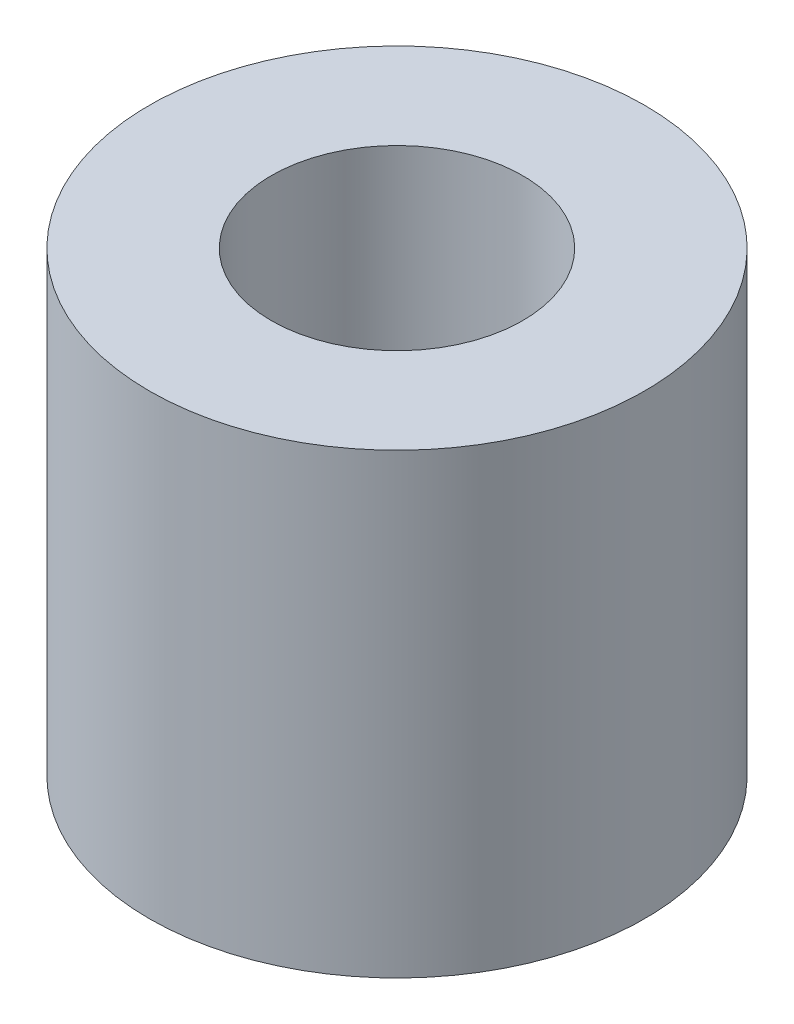
ISO-10303-21;
HEADER;
FILE_DESCRIPTION(('STEP AP214'),'2;1');
FILE_NAME('part.step','',(''),(''),'','','');
FILE_SCHEMA(('AUTOMOTIVE_DESIGN { 1 0 10303 214 1 1 1 1 }'));
ENDSEC;
DATA;
#1=APPLICATION_CONTEXT('core data for automotive mechanical design processes');
#2=APPLICATION_PROTOCOL_DEFINITION('international standard','automotive_design',2000,#1);
#3=PRODUCT_CONTEXT('',#1,'mechanical');
#4=PRODUCT('Part','Part','',(#3));
#5=PRODUCT_RELATED_PRODUCT_CATEGORY('part','',(#4));
#6=PRODUCT_DEFINITION_FORMATION('','',#4);
#7=PRODUCT_DEFINITION_CONTEXT('part definition',#1,'design');
#8=PRODUCT_DEFINITION('design','',#6,#7);
#9=PRODUCT_DEFINITION_SHAPE('','',#8);
#10=(LENGTH_UNIT() NAMED_UNIT(*) SI_UNIT(.MILLI.,.METRE.));
#11=(NAMED_UNIT(*) PLANE_ANGLE_UNIT() SI_UNIT($,.RADIAN.));
#12=(NAMED_UNIT(*) SI_UNIT($,.STERADIAN.) SOLID_ANGLE_UNIT());
#13=UNCERTAINTY_MEASURE_WITH_UNIT(LENGTH_MEASURE(1.E-05),#10,'distance_accuracy_value','');
#14=(GEOMETRIC_REPRESENTATION_CONTEXT(3) GLOBAL_UNCERTAINTY_ASSIGNED_CONTEXT((#13)) GLOBAL_UNIT_ASSIGNED_CONTEXT((#10,
#11,#12)) REPRESENTATION_CONTEXT('',''));
#15=CARTESIAN_POINT('',(0.,0.,0.));
#16=DIRECTION('',(0.,0.,1.));
#17=DIRECTION('',(1.,0.,0.));
#18=AXIS2_PLACEMENT_3D('',#15,#16,#17);
#19=CARTESIAN_POINT('',(-125.96,136.,193.22));
#20=DIRECTION('',(0.,-1.,0.));
#21=DIRECTION('',(0.,0.,-1.));
#22=AXIS2_PLACEMENT_3D('',#19,#20,#21);
#23=CYLINDRICAL_SURFACE('',#22,1.65);
#24=CARTESIAN_POINT('',(-125.96,136.,193.22));
#25=DIRECTION('',(0.,1.,0.));
#26=DIRECTION('',(0.,0.,1.));
#27=AXIS2_PLACEMENT_3D('',#24,#25,#26);
#28=CIRCLE('',#27,1.65);
#29=CARTESIAN_POINT('',(-125.96,136.,194.87));
#30=VERTEX_POINT('',#29);
#31=EDGE_CURVE('E9',#30,#30,#28,.T.);
#32=ORIENTED_EDGE('',*,*,#31,.T.);
#33=EDGE_LOOP('',(#32));
#34=FACE_BOUND('',#33,.T.);
#35=CARTESIAN_POINT('',(-125.96,130.,193.22));
#36=DIRECTION('',(0.,1.,0.));
#37=DIRECTION('',(0.,0.,1.));
#38=AXIS2_PLACEMENT_3D('',#35,#36,#37);
#39=CIRCLE('',#38,1.65);
#40=CARTESIAN_POINT('',(-125.96,130.,194.87));
#41=VERTEX_POINT('',#40);
#42=EDGE_CURVE('E18',#41,#41,#39,.T.);
#43=ORIENTED_EDGE('',*,*,#42,.F.);
#44=EDGE_LOOP('',(#43));
#45=FACE_BOUND('',#44,.T.);
#46=ADVANCED_FACE('F14',(#34,#45),#23,.F.);
#47=CARTESIAN_POINT('',(-125.96,136.,193.22));
#48=DIRECTION('',(0.,-1.,0.));
#49=DIRECTION('',(0.,0.,-1.));
#50=AXIS2_PLACEMENT_3D('',#47,#48,#49);
#51=CYLINDRICAL_SURFACE('',#50,3.25);
#52=CARTESIAN_POINT('',(-125.96,136.,193.22));
#53=DIRECTION('',(0.,1.,0.));
#54=DIRECTION('',(0.,0.,1.));
#55=AXIS2_PLACEMENT_3D('',#52,#53,#54);
#56=CIRCLE('',#55,3.25);
#57=CARTESIAN_POINT('',(-125.96,136.,196.47));
#58=VERTEX_POINT('',#57);
#59=EDGE_CURVE('E23',#58,#58,#56,.T.);
#60=ORIENTED_EDGE('',*,*,#59,.F.);
#61=EDGE_LOOP('',(#60));
#62=FACE_BOUND('',#61,.T.);
#63=CARTESIAN_POINT('',(-125.96,130.,193.22));
#64=DIRECTION('',(0.,1.,0.));
#65=DIRECTION('',(0.,0.,1.));
#66=AXIS2_PLACEMENT_3D('',#63,#64,#65);
#67=CIRCLE('',#66,3.25);
#68=CARTESIAN_POINT('',(-125.96,130.,196.47));
#69=VERTEX_POINT('',#68);
#70=EDGE_CURVE('E34',#69,#69,#67,.T.);
#71=ORIENTED_EDGE('',*,*,#70,.T.);
#72=EDGE_LOOP('',(#71));
#73=FACE_BOUND('',#72,.T.);
#74=ADVANCED_FACE('F16',(#62,#73),#51,.T.);
#75=CARTESIAN_POINT('',(-100.,136.,147.5));
#76=DIRECTION('',(0.,1.,0.));
#77=DIRECTION('',(-1.,0.,0.));
#78=AXIS2_PLACEMENT_3D('',#75,#76,#77);
#79=PLANE('',#78);
#80=ORIENTED_EDGE('',*,*,#31,.F.);
#81=EDGE_LOOP('',(#80));
#82=FACE_BOUND('',#81,.T.);
#83=ORIENTED_EDGE('',*,*,#59,.T.);
#84=EDGE_LOOP('',(#83));
#85=FACE_BOUND('',#84,.T.);
#86=ADVANCED_FACE('F52',(#82,#85),#79,.T.);
#87=CARTESIAN_POINT('',(-100.,130.,147.5));
#88=DIRECTION('',(0.,1.,0.));
#89=DIRECTION('',(-1.,0.,0.));
#90=AXIS2_PLACEMENT_3D('',#87,#88,#89);
#91=PLANE('',#90);
#92=ORIENTED_EDGE('',*,*,#42,.T.);
#93=EDGE_LOOP('',(#92));
#94=FACE_BOUND('',#93,.T.);
#95=ORIENTED_EDGE('',*,*,#70,.F.);
#96=EDGE_LOOP('',(#95));
#97=FACE_BOUND('',#96,.T.);
#98=ADVANCED_FACE('F44',(#94,#97),#91,.F.);
#99=CLOSED_SHELL('',(#46,#74,#86,#98));
#100=MANIFOLD_SOLID_BREP('B1',#99);
#101=ADVANCED_BREP_SHAPE_REPRESENTATION('',(#18,#100),#14);
#102=SHAPE_DEFINITION_REPRESENTATION(#9,#101);
ENDSEC;
END-ISO-10303-21;
